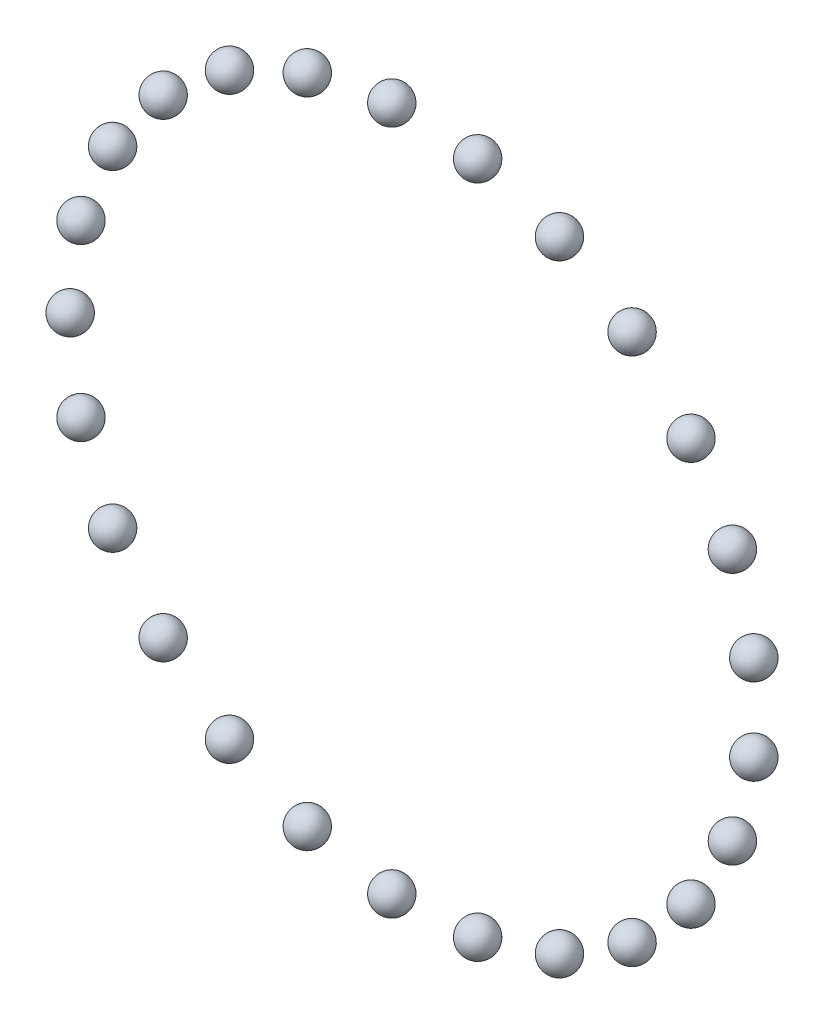
ISO-10303-21;
HEADER;
FILE_DESCRIPTION(('STEP AP214'),'2;1');
FILE_NAME('part.step','',(''),(''),'','','');
FILE_SCHEMA(('AUTOMOTIVE_DESIGN { 1 0 10303 214 1 1 1 1 }'));
ENDSEC;
DATA;
#1=APPLICATION_CONTEXT('core data for automotive mechanical design processes');
#2=APPLICATION_PROTOCOL_DEFINITION('international standard','automotive_design',2000,#1);
#3=PRODUCT_CONTEXT('',#1,'mechanical');
#4=PRODUCT('Part','Part','',(#3));
#5=PRODUCT_RELATED_PRODUCT_CATEGORY('part','',(#4));
#6=PRODUCT_DEFINITION_FORMATION('','',#4);
#7=PRODUCT_DEFINITION_CONTEXT('part definition',#1,'design');
#8=PRODUCT_DEFINITION('design','',#6,#7);
#9=PRODUCT_DEFINITION_SHAPE('','',#8);
#10=(LENGTH_UNIT() NAMED_UNIT(*) SI_UNIT(.MILLI.,.METRE.));
#11=(NAMED_UNIT(*) PLANE_ANGLE_UNIT() SI_UNIT($,.RADIAN.));
#12=(NAMED_UNIT(*) SI_UNIT($,.STERADIAN.) SOLID_ANGLE_UNIT());
#13=UNCERTAINTY_MEASURE_WITH_UNIT(LENGTH_MEASURE(1.E-05),#10,'distance_accuracy_value','');
#14=(GEOMETRIC_REPRESENTATION_CONTEXT(3) GLOBAL_UNCERTAINTY_ASSIGNED_CONTEXT((#13)) GLOBAL_UNIT_ASSIGNED_CONTEXT((#10,
#11,#12)) REPRESENTATION_CONTEXT('',''));
#15=CARTESIAN_POINT('',(0.,0.,0.));
#16=DIRECTION('',(0.,0.,1.));
#17=DIRECTION('',(1.,0.,0.));
#18=AXIS2_PLACEMENT_3D('',#15,#16,#17);
#19=CARTESIAN_POINT('',(-77.4866528902908,-19.8951909731873,0.));
#20=DIRECTION('',(-0.968583161128635,-0.248689887164842,0.));
#21=DIRECTION('',(-0.248689887164842,0.968583161128635,0.));
#22=AXIS2_PLACEMENT_3D('',#19,#20,#21);
#23=SPHERICAL_SURFACE('',#22,4.00000000000001);
#24=CARTESIAN_POINT('',(-81.3609855348053,-20.8899505218467,0.));
#25=VERTEX_POINT('',#24);
#26=VERTEX_LOOP('',#25);
#27=FACE_BOUND('',#26,.T.);
#28=ADVANCED_FACE('F38',(#27),#23,.T.);
#29=CLOSED_SHELL('',(#28));
#30=MANIFOLD_SOLID_BREP('B2',#29);
#31=CARTESIAN_POINT('',(-70.1045344035096,-38.5402939281363,0.));
#32=DIRECTION('',(-0.87630668004387,-0.481753674101704,0.));
#33=DIRECTION('',(-0.481753674101704,0.87630668004387,0.));
#34=AXIS2_PLACEMENT_3D('',#31,#32,#33);
#35=SPHERICAL_SURFACE('',#34,4.00000000000001);
#36=CARTESIAN_POINT('',(-73.6097611236851,-40.4673086245431,0.));
#37=VERTEX_POINT('',#36);
#38=VERTEX_LOOP('',#37);
#39=FACE_BOUND('',#38,.T.);
#40=ADVANCED_FACE('F57',(#39),#35,.T.);
#41=CLOSED_SHELL('',(#40));
#42=MANIFOLD_SOLID_BREP('B6',#41);
#43=CARTESIAN_POINT('',(-58.3174901937136,-54.7637684742943,0.));
#44=DIRECTION('',(-0.72896862742142,-0.684547105928679,0.));
#45=DIRECTION('',(-0.684547105928679,0.72896862742142,0.));
#46=AXIS2_PLACEMENT_3D('',#43,#44,#45);
#47=SPHERICAL_SURFACE('',#46,4.00000000000001);
#48=CARTESIAN_POINT('',(-61.2333647033993,-57.5019568980091,0.));
#49=VERTEX_POINT('',#48);
#50=VERTEX_LOOP('',#49);
#51=FACE_BOUND('',#50,.T.);
#52=ADVANCED_FACE('F76',(#51),#47,.T.);
#53=CLOSED_SHELL('',(#52));
#54=MANIFOLD_SOLID_BREP('B34',#53);
#55=CARTESIAN_POINT('',(-42.8661435983205,-67.5462340401607,0.));
#56=DIRECTION('',(-0.535826794979007,-0.844327925502009,0.));
#57=DIRECTION('',(-0.844327925502009,0.535826794979007,0.));
#58=AXIS2_PLACEMENT_3D('',#55,#56,#57);
#59=SPHERICAL_SURFACE('',#58,4.00000000000001);
#60=CARTESIAN_POINT('',(-45.0094507782365,-70.9235457421687,0.));
#61=VERTEX_POINT('',#60);
#62=VERTEX_LOOP('',#61);
#63=FACE_BOUND('',#62,.T.);
#64=ADVANCED_FACE('F95',(#63),#59,.T.);
#65=CLOSED_SHELL('',(#64));
#66=MANIFOLD_SOLID_BREP('B53',#65);
#67=CARTESIAN_POINT('',(-24.7213595499967,-76.084521303612,0.));
#68=DIRECTION('',(-0.309016994374958,-0.95105651629515,0.));
#69=DIRECTION('',(-0.95105651629515,0.309016994374958,0.));
#70=AXIS2_PLACEMENT_3D('',#67,#68,#69);
#71=SPHERICAL_SURFACE('',#70,4.00000000000001);
#72=CARTESIAN_POINT('',(-25.9574275274965,-79.8887473687926,0.));
#73=VERTEX_POINT('',#72);
#74=VERTEX_LOOP('',#73);
#75=FACE_BOUND('',#74,.T.);
#76=ADVANCED_FACE('F114',(#75),#71,.T.);
#77=CLOSED_SHELL('',(#76));
#78=MANIFOLD_SOLID_BREP('B72',#77);
#79=CARTESIAN_POINT('',(-5.02324156234595,-79.8421382742617,0.));
#80=DIRECTION('',(-0.0627905195293244,-0.998026728428271,0.));
#81=DIRECTION('',(-0.998026728428271,0.0627905195293244,0.));
#82=AXIS2_PLACEMENT_3D('',#79,#80,#81);
#83=SPHERICAL_SURFACE('',#82,4.00000000000001);
#84=CARTESIAN_POINT('',(-5.27440364046325,-83.8342451879748,0.));
#85=VERTEX_POINT('',#84);
#86=VERTEX_LOOP('',#85);
#87=FACE_BOUND('',#86,.T.);
#88=ADVANCED_FACE('F133',(#87),#83,.T.);
#89=CLOSED_SHELL('',(#88));
#90=MANIFOLD_SOLID_BREP('B91',#89);
#91=CARTESIAN_POINT('',(14.9905051668572,-78.5829800582952,0.));
#92=DIRECTION('',(0.187381314585715,-0.982287250728691,0.));
#93=DIRECTION('',(-0.982287250728691,-0.187381314585715,0.));
#94=AXIS2_PLACEMENT_3D('',#91,#92,#93);
#95=SPHERICAL_SURFACE('',#94,4.00000000000001);
#96=CARTESIAN_POINT('',(15.7400304252001,-82.51212906121,0.));
#97=VERTEX_POINT('',#96);
#98=VERTEX_LOOP('',#97);
#99=FACE_BOUND('',#98,.T.);
#100=ADVANCED_FACE('F152',(#99),#95,.T.);
#101=CLOSED_SHELL('',(#100));
#102=MANIFOLD_SOLID_BREP('B110',#101);
#103=CARTESIAN_POINT('',(34.0623433252051,-72.3861641972819,0.));
#104=DIRECTION('',(0.425779291565064,-0.904827052466024,0.));
#105=DIRECTION('',(-0.904827052466024,-0.425779291565064,0.));
#106=AXIS2_PLACEMENT_3D('',#103,#104,#105);
#107=SPHERICAL_SURFACE('',#106,4.00000000000001);
#108=CARTESIAN_POINT('',(35.7654604914654,-76.005472407146,0.));
#109=VERTEX_POINT('',#108);
#110=VERTEX_LOOP('',#109);
#111=FACE_BOUND('',#110,.T.);
#112=ADVANCED_FACE('F171',(#111),#107,.T.);
#113=CLOSED_SHELL('',(#112));
#114=MANIFOLD_SOLID_BREP('B129',#113);
#115=CARTESIAN_POINT('',(50.9939191798946,-61.6410594220636,0.));
#116=DIRECTION('',(0.637423989748683,-0.770513242775795,0.));
#117=DIRECTION('',(-0.770513242775795,-0.637423989748683,0.));
#118=AXIS2_PLACEMENT_3D('',#115,#116,#117);
#119=SPHERICAL_SURFACE('',#118,4.00000000000001);
#120=CARTESIAN_POINT('',(53.5436151388894,-64.7231123931668,0.));
#121=VERTEX_POINT('',#120);
#122=VERTEX_LOOP('',#121);
#123=FACE_BOUND('',#122,.T.);
#124=ADVANCED_FACE('F190',(#123),#119,.T.);
#125=CLOSED_SHELL('',(#124));
#126=MANIFOLD_SOLID_BREP('B148',#125);
#127=CARTESIAN_POINT('',(64.7213595499954,-47.0228201833984,0.));
#128=DIRECTION('',(0.809016994374942,-0.58778525229248,0.));
#129=DIRECTION('',(-0.58778525229248,-0.809016994374942,0.));
#130=AXIS2_PLACEMENT_3D('',#127,#128,#129);
#131=SPHERICAL_SURFACE('',#130,4.00000000000001);
#132=CARTESIAN_POINT('',(67.9574275274951,-49.3739611925683,0.));
#133=VERTEX_POINT('',#132);
#134=VERTEX_LOOP('',#133);
#135=FACE_BOUND('',#134,.T.);
#136=ADVANCED_FACE('F209',(#135),#131,.T.);
#137=CLOSED_SHELL('',(#136));
#138=MANIFOLD_SOLID_BREP('B167',#137);
#139=CARTESIAN_POINT('',(74.3821188710599,-29.4499642147748,0.));
#140=DIRECTION('',(0.929776485888248,-0.368124552684685,0.));
#141=DIRECTION('',(-0.368124552684685,-0.929776485888248,0.));
#142=AXIS2_PLACEMENT_3D('',#139,#140,#141);
#143=SPHERICAL_SURFACE('',#142,4.00000000000001);
#144=CARTESIAN_POINT('',(78.1012248146129,-30.9224624255136,0.));
#145=VERTEX_POINT('',#144);
#146=VERTEX_LOOP('',#145);
#147=FACE_BOUND('',#146,.T.);
#148=ADVANCED_FACE('F228',(#147),#143,.T.);
#149=CLOSED_SHELL('',(#148));
#150=MANIFOLD_SOLID_BREP('B186',#149);
#151=CARTESIAN_POINT('',(79.3691761051582,-10.0266586851449,0.));
#152=DIRECTION('',(0.992114701314477,-0.125333233564311,0.));
#153=DIRECTION('',(-0.125333233564311,-0.992114701314477,0.));
#154=AXIS2_PLACEMENT_3D('',#151,#152,#153);
#155=SPHERICAL_SURFACE('',#154,4.00000000000001);
#156=CARTESIAN_POINT('',(83.3376349104161,-10.5279916194022,0.));
#157=VERTEX_POINT('',#156);
#158=VERTEX_LOOP('',#157);
#159=FACE_BOUND('',#158,.T.);
#160=ADVANCED_FACE('F247',(#159),#155,.T.);
#161=CLOSED_SHELL('',(#160));
#162=MANIFOLD_SOLID_BREP('B205',#161);
#163=CARTESIAN_POINT('',(79.3691761051583,10.0266586851438,0.));
#164=DIRECTION('',(0.992114701314479,0.125333233564297,0.));
#165=DIRECTION('',(0.125333233564297,-0.992114701314479,0.));
#166=AXIS2_PLACEMENT_3D('',#163,#164,#165);
#167=SPHERICAL_SURFACE('',#166,4.00000000000001);
#168=CARTESIAN_POINT('',(83.3376349104162,10.527991619401,0.));
#169=VERTEX_POINT('',#168);
#170=VERTEX_LOOP('',#169);
#171=FACE_BOUND('',#170,.T.);
#172=ADVANCED_FACE('F266',(#171),#167,.T.);
#173=CLOSED_SHELL('',(#172));
#174=MANIFOLD_SOLID_BREP('B224',#173);
#175=CARTESIAN_POINT('',(74.3821188710603,29.4499642147738,0.));
#176=DIRECTION('',(0.929776485888254,0.368124552684672,0.));
#177=DIRECTION('',(0.368124552684672,-0.929776485888254,0.));
#178=AXIS2_PLACEMENT_3D('',#175,#176,#177);
#179=SPHERICAL_SURFACE('',#178,4.00000000000001);
#180=CARTESIAN_POINT('',(78.1012248146133,30.9224624255124,0.));
#181=VERTEX_POINT('',#180);
#182=VERTEX_LOOP('',#181);
#183=FACE_BOUND('',#182,.T.);
#184=ADVANCED_FACE('F285',(#183),#179,.T.);
#185=CLOSED_SHELL('',(#184));
#186=MANIFOLD_SOLID_BREP('B243',#185);
#187=CARTESIAN_POINT('',(64.7213595499961,47.0228201833975,0.));
#188=DIRECTION('',(0.809016994374951,0.587785252292469,0.));
#189=DIRECTION('',(0.587785252292469,-0.809016994374951,0.));
#190=AXIS2_PLACEMENT_3D('',#187,#188,#189);
#191=SPHERICAL_SURFACE('',#190,4.00000000000001);
#192=CARTESIAN_POINT('',(67.9574275274959,49.3739611925674,0.));
#193=VERTEX_POINT('',#192);
#194=VERTEX_LOOP('',#193);
#195=FACE_BOUND('',#194,.T.);
#196=ADVANCED_FACE('F304',(#195),#191,.T.);
#197=CLOSED_SHELL('',(#196));
#198=MANIFOLD_SOLID_BREP('B262',#197);
#199=CARTESIAN_POINT('',(50.9939191798955,61.6410594220629,0.));
#200=DIRECTION('',(0.637423989748694,0.770513242775786,0.));
#201=DIRECTION('',(0.770513242775786,-0.637423989748694,0.));
#202=AXIS2_PLACEMENT_3D('',#199,#200,#201);
#203=SPHERICAL_SURFACE('',#202,4.00000000000001);
#204=CARTESIAN_POINT('',(53.5436151388903,64.723112393166,0.));
#205=VERTEX_POINT('',#204);
#206=VERTEX_LOOP('',#205);
#207=FACE_BOUND('',#206,.T.);
#208=ADVANCED_FACE('F323',(#207),#203,.T.);
#209=CLOSED_SHELL('',(#208));
#210=MANIFOLD_SOLID_BREP('B281',#209);
#211=CARTESIAN_POINT('',(34.0623433252061,72.3861641972814,0.));
#212=DIRECTION('',(0.425779291565077,0.904827052466018,0.));
#213=DIRECTION('',(0.904827052466018,-0.425779291565077,0.));
#214=AXIS2_PLACEMENT_3D('',#211,#212,#213);
#215=SPHERICAL_SURFACE('',#214,4.00000000000001);
#216=CARTESIAN_POINT('',(35.7654604914664,76.0054724071455,0.));
#217=VERTEX_POINT('',#216);
#218=VERTEX_LOOP('',#217);
#219=FACE_BOUND('',#218,.T.);
#220=ADVANCED_FACE('F342',(#219),#215,.T.);
#221=CLOSED_SHELL('',(#220));
#222=MANIFOLD_SOLID_BREP('B300',#221);
#223=CARTESIAN_POINT('',(14.9905051668583,78.582980058295,0.));
#224=DIRECTION('',(0.187381314585729,0.982287250728688,0.));
#225=DIRECTION('',(0.982287250728688,-0.187381314585729,0.));
#226=AXIS2_PLACEMENT_3D('',#223,#224,#225);
#227=SPHERICAL_SURFACE('',#226,4.00000000000001);
#228=CARTESIAN_POINT('',(15.7400304252012,82.5121290612098,0.));
#229=VERTEX_POINT('',#228);
#230=VERTEX_LOOP('',#229);
#231=FACE_BOUND('',#230,.T.);
#232=ADVANCED_FACE('F361',(#231),#227,.T.);
#233=CLOSED_SHELL('',(#232));
#234=MANIFOLD_SOLID_BREP('B319',#233);
#235=CARTESIAN_POINT('',(-5.0232415623448,79.8421382742617,0.));
#236=DIRECTION('',(-0.06279051952931,0.998026728428272,0.));
#237=DIRECTION('',(0.998026728428272,0.06279051952931,0.));
#238=AXIS2_PLACEMENT_3D('',#235,#236,#237);
#239=SPHERICAL_SURFACE('',#238,4.00000000000001);
#240=CARTESIAN_POINT('',(-5.27440364046204,83.8342451879748,0.));
#241=VERTEX_POINT('',#240);
#242=VERTEX_LOOP('',#241);
#243=FACE_BOUND('',#242,.T.);
#244=ADVANCED_FACE('F380',(#243),#239,.T.);
#245=CLOSED_SHELL('',(#244));
#246=MANIFOLD_SOLID_BREP('B338',#245);
#247=CARTESIAN_POINT('',(-24.7213595499956,76.0845213036124,0.));
#248=DIRECTION('',(-0.309016994374945,0.951056516295155,0.));
#249=DIRECTION('',(0.951056516295155,0.309016994374945,0.));
#250=AXIS2_PLACEMENT_3D('',#247,#248,#249);
#251=SPHERICAL_SURFACE('',#250,4.00000000000001);
#252=CARTESIAN_POINT('',(-25.9574275274954,79.888747368793,0.));
#253=VERTEX_POINT('',#252);
#254=VERTEX_LOOP('',#253);
#255=FACE_BOUND('',#254,.T.);
#256=ADVANCED_FACE('F399',(#255),#251,.T.);
#257=CLOSED_SHELL('',(#256));
#258=MANIFOLD_SOLID_BREP('B357',#257);
#259=CARTESIAN_POINT('',(-42.8661435983196,67.5462340401613,0.));
#260=DIRECTION('',(-0.535826794978995,0.844327925502017,0.));
#261=DIRECTION('',(0.844327925502017,0.535826794978995,0.));
#262=AXIS2_PLACEMENT_3D('',#259,#260,#261);
#263=SPHERICAL_SURFACE('',#262,4.00000000000001);
#264=CARTESIAN_POINT('',(-45.0094507782356,70.9235457421694,0.));
#265=VERTEX_POINT('',#264);
#266=VERTEX_LOOP('',#265);
#267=FACE_BOUND('',#266,.T.);
#268=ADVANCED_FACE('F418',(#267),#263,.T.);
#269=CLOSED_SHELL('',(#268));
#270=MANIFOLD_SOLID_BREP('B376',#269);
#271=CARTESIAN_POINT('',(-58.3174901937128,54.7637684742952,0.));
#272=DIRECTION('',(-0.72896862742141,0.68454710592869,0.));
#273=DIRECTION('',(0.68454710592869,0.72896862742141,0.));
#274=AXIS2_PLACEMENT_3D('',#271,#272,#273);
#275=SPHERICAL_SURFACE('',#274,4.00000000000001);
#276=CARTESIAN_POINT('',(-61.2333647033985,57.50195689801,0.));
#277=VERTEX_POINT('',#276);
#278=VERTEX_LOOP('',#277);
#279=FACE_BOUND('',#278,.T.);
#280=ADVANCED_FACE('F437',(#279),#275,.T.);
#281=CLOSED_SHELL('',(#280));
#282=MANIFOLD_SOLID_BREP('B395',#281);
#283=CARTESIAN_POINT('',(-70.104534403509,38.5402939281373,0.));
#284=DIRECTION('',(-0.876306680043863,0.481753674101716,0.));
#285=DIRECTION('',(0.481753674101716,0.876306680043863,0.));
#286=AXIS2_PLACEMENT_3D('',#283,#284,#285);
#287=SPHERICAL_SURFACE('',#286,4.00000000000001);
#288=CARTESIAN_POINT('',(-73.6097611236845,40.4673086245442,0.));
#289=VERTEX_POINT('',#288);
#290=VERTEX_LOOP('',#289);
#291=FACE_BOUND('',#290,.T.);
#292=ADVANCED_FACE('F456',(#291),#287,.T.);
#293=CLOSED_SHELL('',(#292));
#294=MANIFOLD_SOLID_BREP('B414',#293);
#295=CARTESIAN_POINT('',(-77.4866528902905,19.8951909731884,0.));
#296=DIRECTION('',(-0.968583161128631,0.248689887164855,0.));
#297=DIRECTION('',(0.248689887164855,0.968583161128631,0.));
#298=AXIS2_PLACEMENT_3D('',#295,#296,#297);
#299=SPHERICAL_SURFACE('',#298,4.00000000000001);
#300=CARTESIAN_POINT('',(-81.360985534805,20.8899505218479,0.));
#301=VERTEX_POINT('',#300);
#302=VERTEX_LOOP('',#301);
#303=FACE_BOUND('',#302,.T.);
#304=ADVANCED_FACE('F474',(#303),#299,.T.);
#305=CLOSED_SHELL('',(#304));
#306=MANIFOLD_SOLID_BREP('B433',#305);
#307=CARTESIAN_POINT('',(-80.,0.,0.));
#308=DIRECTION('',(-1.,0.,0.));
#309=DIRECTION('',(0.,1.,0.));
#310=AXIS2_PLACEMENT_3D('',#307,#308,#309);
#311=SPHERICAL_SURFACE('',#310,4.00000000000001);
#312=CARTESIAN_POINT('',(-84.,0.,0.));
#313=VERTEX_POINT('',#312);
#314=VERTEX_LOOP('',#313);
#315=FACE_BOUND('',#314,.T.);
#316=ADVANCED_FACE('F487',(#315),#311,.T.);
#317=CLOSED_SHELL('',(#316));
#318=MANIFOLD_SOLID_BREP('B452',#317);
#319=ADVANCED_BREP_SHAPE_REPRESENTATION('',(#18,#30,#42,#54,#66,#78,#90,#102,#114,#126,#138,
#150,#162,#174,#186,#198,#210,#222,#234,#246,#258,#270,#282,#294,#306,#318),#14);
#320=SHAPE_DEFINITION_REPRESENTATION(#9,#319);
ENDSEC;
END-ISO-10303-21;
